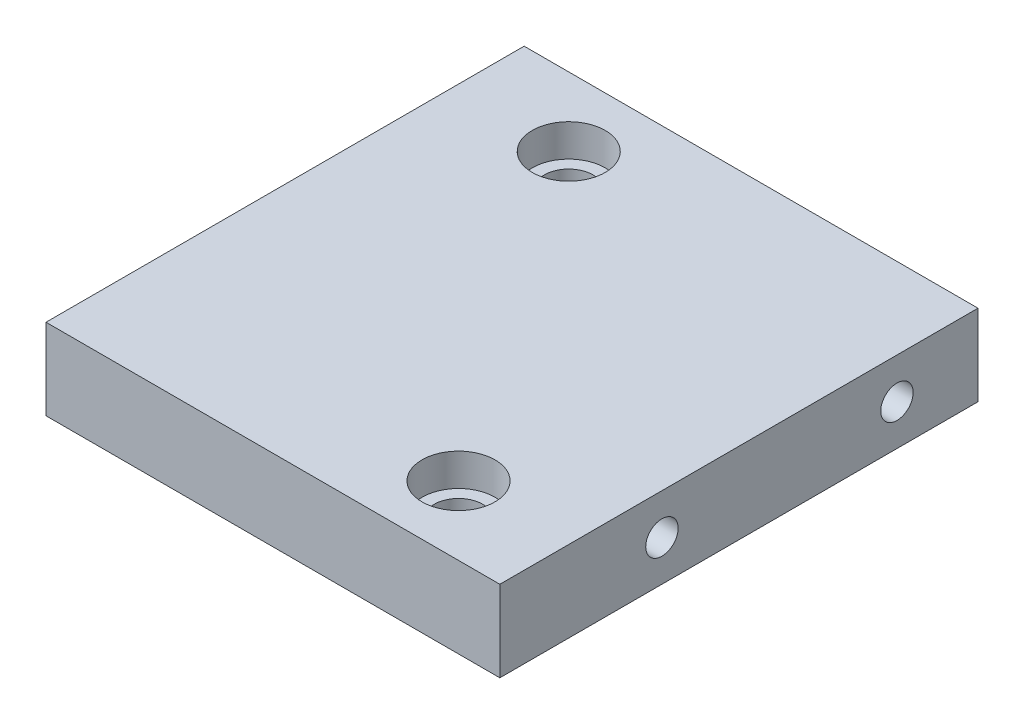
ISO-10303-21;
HEADER;
FILE_DESCRIPTION(('STEP AP214'),'2;1');
FILE_NAME('part.step','',(''),(''),'','','');
FILE_SCHEMA(('AUTOMOTIVE_DESIGN { 1 0 10303 214 1 1 1 1 }'));
ENDSEC;
DATA;
#1=APPLICATION_CONTEXT('core data for automotive mechanical design processes');
#2=APPLICATION_PROTOCOL_DEFINITION('international standard','automotive_design',2000,#1);
#3=PRODUCT_CONTEXT('',#1,'mechanical');
#4=PRODUCT('Part','Part','',(#3));
#5=PRODUCT_RELATED_PRODUCT_CATEGORY('part','',(#4));
#6=PRODUCT_DEFINITION_FORMATION('','',#4);
#7=PRODUCT_DEFINITION_CONTEXT('part definition',#1,'design');
#8=PRODUCT_DEFINITION('design','',#6,#7);
#9=PRODUCT_DEFINITION_SHAPE('','',#8);
#10=(LENGTH_UNIT() NAMED_UNIT(*) SI_UNIT(.MILLI.,.METRE.));
#11=(NAMED_UNIT(*) PLANE_ANGLE_UNIT() SI_UNIT($,.RADIAN.));
#12=(NAMED_UNIT(*) SI_UNIT($,.STERADIAN.) SOLID_ANGLE_UNIT());
#13=UNCERTAINTY_MEASURE_WITH_UNIT(LENGTH_MEASURE(1.E-05),#10,'distance_accuracy_value','');
#14=(GEOMETRIC_REPRESENTATION_CONTEXT(3) GLOBAL_UNCERTAINTY_ASSIGNED_CONTEXT((#13)) GLOBAL_UNIT_ASSIGNED_CONTEXT((#10,
#11,#12)) REPRESENTATION_CONTEXT('',''));
#15=CARTESIAN_POINT('',(0.,0.,0.));
#16=DIRECTION('',(0.,0.,1.));
#17=DIRECTION('',(1.,0.,0.));
#18=AXIS2_PLACEMENT_3D('',#15,#16,#17);
#19=CARTESIAN_POINT('',(-6.8,5.,25.25));
#20=DIRECTION('',(0.,-1.,0.));
#21=DIRECTION('',(0.,0.,-1.));
#22=AXIS2_PLACEMENT_3D('',#19,#20,#21);
#23=CYLINDRICAL_SURFACE('',#22,1.5);
#24=CARTESIAN_POINT('',(-6.8,0.,25.25));
#25=DIRECTION('',(0.,1.,0.));
#26=DIRECTION('',(0.,0.,1.));
#27=AXIS2_PLACEMENT_3D('',#24,#25,#26);
#28=CIRCLE('',#27,1.5);
#29=CARTESIAN_POINT('',(-6.8,0.,26.75));
#30=VERTEX_POINT('',#29);
#31=EDGE_CURVE('E118',#30,#30,#28,.T.);
#32=ORIENTED_EDGE('',*,*,#31,.F.);
#33=EDGE_LOOP('',(#32));
#34=FACE_BOUND('',#33,.T.);
#35=CARTESIAN_POINT('',(-6.8,3.,25.25));
#36=DIRECTION('',(0.,1.,0.));
#37=DIRECTION('',(0.,0.,1.));
#38=AXIS2_PLACEMENT_3D('',#35,#36,#37);
#39=CIRCLE('',#38,1.5);
#40=CARTESIAN_POINT('',(-6.8,3.,26.75));
#41=VERTEX_POINT('',#40);
#42=EDGE_CURVE('E39',#41,#41,#39,.T.);
#43=ORIENTED_EDGE('',*,*,#42,.T.);
#44=EDGE_LOOP('',(#43));
#45=FACE_BOUND('',#44,.T.);
#46=ADVANCED_FACE('F35',(#34,#45),#23,.F.);
#47=CARTESIAN_POINT('',(-21.,5.,4.24999999999998));
#48=DIRECTION('',(0.,-1.,0.));
#49=DIRECTION('',(0.,0.,-1.));
#50=AXIS2_PLACEMENT_3D('',#47,#48,#49);
#51=CYLINDRICAL_SURFACE('',#50,1.5);
#52=CARTESIAN_POINT('',(-21.,0.,4.24999999999998));
#53=DIRECTION('',(0.,1.,0.));
#54=DIRECTION('',(0.,0.,1.));
#55=AXIS2_PLACEMENT_3D('',#52,#53,#54);
#56=CIRCLE('',#55,1.5);
#57=CARTESIAN_POINT('',(-21.,0.,5.74999999999997));
#58=VERTEX_POINT('',#57);
#59=EDGE_CURVE('E104',#58,#58,#56,.T.);
#60=ORIENTED_EDGE('',*,*,#59,.F.);
#61=EDGE_LOOP('',(#60));
#62=FACE_BOUND('',#61,.T.);
#63=CARTESIAN_POINT('',(-21.,3.,4.24999999999998));
#64=DIRECTION('',(0.,1.,0.));
#65=DIRECTION('',(0.,0.,1.));
#66=AXIS2_PLACEMENT_3D('',#63,#64,#65);
#67=CIRCLE('',#66,1.5);
#68=CARTESIAN_POINT('',(-21.,3.,5.74999999999997));
#69=VERTEX_POINT('',#68);
#70=EDGE_CURVE('E112',#69,#69,#67,.T.);
#71=ORIENTED_EDGE('',*,*,#70,.T.);
#72=EDGE_LOOP('',(#71));
#73=FACE_BOUND('',#72,.T.);
#74=ADVANCED_FACE('F147',(#62,#73),#51,.F.);
#75=CARTESIAN_POINT('',(-28.,5.,29.5));
#76=DIRECTION('',(0.,0.,-1.));
#77=DIRECTION('',(-1.,0.,0.));
#78=AXIS2_PLACEMENT_3D('',#75,#76,#77);
#79=PLANE('',#78);
#80=DIRECTION('',(1.,0.,0.));
#81=VECTOR('',#80,1.);
#82=CARTESIAN_POINT('',(-28.,0.,29.5));
#83=LINE('',#82,#81);
#84=CARTESIAN_POINT('',(-28.,0.,29.5));
#85=VERTEX_POINT('',#84);
#86=CARTESIAN_POINT('',(0.,0.,29.5));
#87=VERTEX_POINT('',#86);
#88=EDGE_CURVE('E102',#85,#87,#83,.T.);
#89=ORIENTED_EDGE('',*,*,#88,.T.);
#90=DIRECTION('',(0.,-1.,0.));
#91=VECTOR('',#90,1.);
#92=CARTESIAN_POINT('',(0.,5.,29.5));
#93=LINE('',#92,#91);
#94=CARTESIAN_POINT('',(0.,5.,29.5));
#95=VERTEX_POINT('',#94);
#96=EDGE_CURVE('E11',#95,#87,#93,.T.);
#97=ORIENTED_EDGE('',*,*,#96,.F.);
#98=DIRECTION('',(1.,0.,0.));
#99=VECTOR('',#98,1.);
#100=CARTESIAN_POINT('',(-28.,5.,29.5));
#101=LINE('',#100,#99);
#102=CARTESIAN_POINT('',(-28.,5.,29.5));
#103=VERTEX_POINT('',#102);
#104=EDGE_CURVE('E87',#103,#95,#101,.T.);
#105=ORIENTED_EDGE('',*,*,#104,.F.);
#106=DIRECTION('',(0.,-1.,0.));
#107=VECTOR('',#106,1.);
#108=CARTESIAN_POINT('',(-28.,5.,29.5));
#109=LINE('',#108,#107);
#110=EDGE_CURVE('E54',#103,#85,#109,.T.);
#111=ORIENTED_EDGE('',*,*,#110,.T.);
#112=EDGE_LOOP('',(#89,#97,#105,#111));
#113=FACE_BOUND('',#112,.T.);
#114=ADVANCED_FACE('F37',(#113),#79,.F.);
#115=CARTESIAN_POINT('',(0.,5.,29.5));
#116=DIRECTION('',(-1.,0.,0.));
#117=DIRECTION('',(0.,0.,1.));
#118=AXIS2_PLACEMENT_3D('',#115,#116,#117);
#119=PLANE('',#118);
#120=CARTESIAN_POINT('',(0.,2.5,5.));
#121=DIRECTION('',(-1.,0.,0.));
#122=DIRECTION('',(0.,0.,1.));
#123=AXIS2_PLACEMENT_3D('',#120,#121,#122);
#124=CIRCLE('',#123,1.);
#125=CARTESIAN_POINT('',(0.,2.5,6.));
#126=VERTEX_POINT('',#125);
#127=EDGE_CURVE('E189',#126,#126,#124,.T.);
#128=ORIENTED_EDGE('',*,*,#127,.T.);
#129=EDGE_LOOP('',(#128));
#130=FACE_BOUND('',#129,.T.);
#131=CARTESIAN_POINT('',(0.,2.5,19.5));
#132=DIRECTION('',(-1.,0.,0.));
#133=DIRECTION('',(0.,0.,1.));
#134=AXIS2_PLACEMENT_3D('',#131,#132,#133);
#135=CIRCLE('',#134,1.);
#136=CARTESIAN_POINT('',(0.,2.5,20.5));
#137=VERTEX_POINT('',#136);
#138=EDGE_CURVE('E128',#137,#137,#135,.T.);
#139=ORIENTED_EDGE('',*,*,#138,.T.);
#140=EDGE_LOOP('',(#139));
#141=FACE_BOUND('',#140,.T.);
#142=DIRECTION('',(0.,0.,-1.));
#143=VECTOR('',#142,1.);
#144=CARTESIAN_POINT('',(0.,0.,29.5));
#145=LINE('',#144,#143);
#146=CARTESIAN_POINT('',(0.,0.,0.));
#147=VERTEX_POINT('',#146);
#148=EDGE_CURVE('E92',#87,#147,#145,.T.);
#149=ORIENTED_EDGE('',*,*,#148,.T.);
#150=DIRECTION('',(0.,-1.,0.));
#151=VECTOR('',#150,1.);
#152=CARTESIAN_POINT('',(0.,5.,0.));
#153=LINE('',#152,#151);
#154=CARTESIAN_POINT('',(0.,5.,0.));
#155=VERTEX_POINT('',#154);
#156=EDGE_CURVE('E45',#155,#147,#153,.T.);
#157=ORIENTED_EDGE('',*,*,#156,.F.);
#158=DIRECTION('',(0.,0.,-1.));
#159=VECTOR('',#158,1.);
#160=CARTESIAN_POINT('',(0.,5.,29.5));
#161=LINE('',#160,#159);
#162=EDGE_CURVE('E79',#95,#155,#161,.T.);
#163=ORIENTED_EDGE('',*,*,#162,.F.);
#164=ORIENTED_EDGE('',*,*,#96,.T.);
#165=EDGE_LOOP('',(#149,#157,#163,#164));
#166=FACE_BOUND('',#165,.T.);
#167=ADVANCED_FACE('F91',(#130,#141,#166),#119,.F.);
#168=CARTESIAN_POINT('',(-28.,5.,0.));
#169=DIRECTION('',(0.,0.,-1.));
#170=DIRECTION('',(-1.,0.,0.));
#171=AXIS2_PLACEMENT_3D('',#168,#169,#170);
#172=PLANE('',#171);
#173=DIRECTION('',(1.,0.,0.));
#174=VECTOR('',#173,1.);
#175=CARTESIAN_POINT('',(-28.,0.,0.));
#176=LINE('',#175,#174);
#177=CARTESIAN_POINT('',(-28.,0.,0.));
#178=VERTEX_POINT('',#177);
#179=EDGE_CURVE('E106',#178,#147,#176,.T.);
#180=ORIENTED_EDGE('',*,*,#179,.F.);
#181=DIRECTION('',(0.,-1.,0.));
#182=VECTOR('',#181,1.);
#183=CARTESIAN_POINT('',(-28.,5.,0.));
#184=LINE('',#183,#182);
#185=CARTESIAN_POINT('',(-28.,5.,0.));
#186=VERTEX_POINT('',#185);
#187=EDGE_CURVE('E68',#186,#178,#184,.T.);
#188=ORIENTED_EDGE('',*,*,#187,.F.);
#189=DIRECTION('',(1.,0.,0.));
#190=VECTOR('',#189,1.);
#191=CARTESIAN_POINT('',(-28.,5.,0.));
#192=LINE('',#191,#190);
#193=EDGE_CURVE('E86',#186,#155,#192,.T.);
#194=ORIENTED_EDGE('',*,*,#193,.T.);
#195=ORIENTED_EDGE('',*,*,#156,.T.);
#196=EDGE_LOOP('',(#180,#188,#194,#195));
#197=FACE_BOUND('',#196,.T.);
#198=ADVANCED_FACE('F96',(#197),#172,.T.);
#199=CARTESIAN_POINT('',(-28.,5.,29.5));
#200=DIRECTION('',(-1.,0.,0.));
#201=DIRECTION('',(0.,0.,1.));
#202=AXIS2_PLACEMENT_3D('',#199,#200,#201);
#203=PLANE('',#202);
#204=DIRECTION('',(0.,0.,-1.));
#205=VECTOR('',#204,1.);
#206=CARTESIAN_POINT('',(-28.,0.,29.5));
#207=LINE('',#206,#205);
#208=EDGE_CURVE('E108',#85,#178,#207,.T.);
#209=ORIENTED_EDGE('',*,*,#208,.F.);
#210=ORIENTED_EDGE('',*,*,#110,.F.);
#211=DIRECTION('',(0.,0.,-1.));
#212=VECTOR('',#211,1.);
#213=CARTESIAN_POINT('',(-28.,5.,29.5));
#214=LINE('',#213,#212);
#215=EDGE_CURVE('E97',#103,#186,#214,.T.);
#216=ORIENTED_EDGE('',*,*,#215,.T.);
#217=ORIENTED_EDGE('',*,*,#187,.T.);
#218=EDGE_LOOP('',(#209,#210,#216,#217));
#219=FACE_BOUND('',#218,.T.);
#220=ADVANCED_FACE('F166',(#219),#203,.T.);
#221=CARTESIAN_POINT('',(0.,5.,0.));
#222=DIRECTION('',(0.,1.,0.));
#223=DIRECTION('',(0.,0.,1.));
#224=AXIS2_PLACEMENT_3D('',#221,#222,#223);
#225=PLANE('',#224);
#226=CARTESIAN_POINT('',(-21.,5.,4.24999999999998));
#227=DIRECTION('',(0.,1.,0.));
#228=DIRECTION('',(0.,0.,1.));
#229=AXIS2_PLACEMENT_3D('',#226,#227,#228);
#230=CIRCLE('',#229,2.25);
#231=CARTESIAN_POINT('',(-21.,5.,6.49999999999997));
#232=VERTEX_POINT('',#231);
#233=EDGE_CURVE('E120',#232,#232,#230,.T.);
#234=ORIENTED_EDGE('',*,*,#233,.F.);
#235=EDGE_LOOP('',(#234));
#236=FACE_BOUND('',#235,.T.);
#237=CARTESIAN_POINT('',(-6.8,5.,25.25));
#238=DIRECTION('',(0.,1.,0.));
#239=DIRECTION('',(0.,0.,1.));
#240=AXIS2_PLACEMENT_3D('',#237,#238,#239);
#241=CIRCLE('',#240,2.25);
#242=CARTESIAN_POINT('',(-6.8,5.,27.5));
#243=VERTEX_POINT('',#242);
#244=EDGE_CURVE('E125',#243,#243,#241,.T.);
#245=ORIENTED_EDGE('',*,*,#244,.F.);
#246=EDGE_LOOP('',(#245));
#247=FACE_BOUND('',#246,.T.);
#248=ORIENTED_EDGE('',*,*,#104,.T.);
#249=ORIENTED_EDGE('',*,*,#162,.T.);
#250=ORIENTED_EDGE('',*,*,#193,.F.);
#251=ORIENTED_EDGE('',*,*,#215,.F.);
#252=EDGE_LOOP('',(#248,#249,#250,#251));
#253=FACE_BOUND('',#252,.T.);
#254=ADVANCED_FACE('F83',(#236,#247,#253),#225,.T.);
#255=CARTESIAN_POINT('',(0.,0.,0.));
#256=DIRECTION('',(0.,1.,0.));
#257=DIRECTION('',(0.,0.,1.));
#258=AXIS2_PLACEMENT_3D('',#255,#256,#257);
#259=PLANE('',#258);
#260=ORIENTED_EDGE('',*,*,#59,.T.);
#261=EDGE_LOOP('',(#260));
#262=FACE_BOUND('',#261,.T.);
#263=ORIENTED_EDGE('',*,*,#31,.T.);
#264=EDGE_LOOP('',(#263));
#265=FACE_BOUND('',#264,.T.);
#266=ORIENTED_EDGE('',*,*,#88,.F.);
#267=ORIENTED_EDGE('',*,*,#208,.T.);
#268=ORIENTED_EDGE('',*,*,#179,.T.);
#269=ORIENTED_EDGE('',*,*,#148,.F.);
#270=EDGE_LOOP('',(#266,#267,#268,#269));
#271=FACE_BOUND('',#270,.T.);
#272=ADVANCED_FACE('F142',(#262,#265,#271),#259,.F.);
#273=CARTESIAN_POINT('',(-21.,3.,4.24999999999998));
#274=DIRECTION('',(0.,1.,0.));
#275=DIRECTION('',(0.,0.,1.));
#276=AXIS2_PLACEMENT_3D('',#273,#274,#275);
#277=CYLINDRICAL_SURFACE('',#276,2.25);
#278=CARTESIAN_POINT('',(-21.,3.,4.24999999999998));
#279=DIRECTION('',(0.,1.,0.));
#280=DIRECTION('',(0.,0.,1.));
#281=AXIS2_PLACEMENT_3D('',#278,#279,#280);
#282=CIRCLE('',#281,2.25);
#283=CARTESIAN_POINT('',(-21.,3.,6.49999999999997));
#284=VERTEX_POINT('',#283);
#285=EDGE_CURVE('E114',#284,#284,#282,.T.);
#286=ORIENTED_EDGE('',*,*,#285,.F.);
#287=EDGE_LOOP('',(#286));
#288=FACE_BOUND('',#287,.T.);
#289=ORIENTED_EDGE('',*,*,#233,.T.);
#290=EDGE_LOOP('',(#289));
#291=FACE_BOUND('',#290,.T.);
#292=ADVANCED_FACE('F173',(#288,#291),#277,.F.);
#293=CARTESIAN_POINT('',(-21.,3.,4.24999999999998));
#294=DIRECTION('',(0.,1.,0.));
#295=DIRECTION('',(0.,0.,1.));
#296=AXIS2_PLACEMENT_3D('',#293,#294,#295);
#297=PLANE('',#296);
#298=ORIENTED_EDGE('',*,*,#70,.F.);
#299=EDGE_LOOP('',(#298));
#300=FACE_BOUND('',#299,.T.);
#301=ORIENTED_EDGE('',*,*,#285,.T.);
#302=EDGE_LOOP('',(#301));
#303=FACE_BOUND('',#302,.T.);
#304=ADVANCED_FACE('F161',(#300,#303),#297,.T.);
#305=CARTESIAN_POINT('',(-6.8,3.,25.25));
#306=DIRECTION('',(0.,1.,0.));
#307=DIRECTION('',(0.,0.,1.));
#308=AXIS2_PLACEMENT_3D('',#305,#306,#307);
#309=CYLINDRICAL_SURFACE('',#308,2.25);
#310=CARTESIAN_POINT('',(-6.8,3.,25.25));
#311=DIRECTION('',(0.,1.,0.));
#312=DIRECTION('',(0.,0.,1.));
#313=AXIS2_PLACEMENT_3D('',#310,#311,#312);
#314=CIRCLE('',#313,2.25);
#315=CARTESIAN_POINT('',(-6.8,3.,27.5));
#316=VERTEX_POINT('',#315);
#317=EDGE_CURVE('E133',#316,#316,#314,.T.);
#318=ORIENTED_EDGE('',*,*,#317,.F.);
#319=EDGE_LOOP('',(#318));
#320=FACE_BOUND('',#319,.T.);
#321=ORIENTED_EDGE('',*,*,#244,.T.);
#322=EDGE_LOOP('',(#321));
#323=FACE_BOUND('',#322,.T.);
#324=ADVANCED_FACE('F155',(#320,#323),#309,.F.);
#325=CARTESIAN_POINT('',(-6.8,3.,25.25));
#326=DIRECTION('',(0.,1.,0.));
#327=DIRECTION('',(0.,0.,1.));
#328=AXIS2_PLACEMENT_3D('',#325,#326,#327);
#329=PLANE('',#328);
#330=ORIENTED_EDGE('',*,*,#42,.F.);
#331=EDGE_LOOP('',(#330));
#332=FACE_BOUND('',#331,.T.);
#333=ORIENTED_EDGE('',*,*,#317,.T.);
#334=EDGE_LOOP('',(#333));
#335=FACE_BOUND('',#334,.T.);
#336=ADVANCED_FACE('F151',(#332,#335),#329,.T.);
#337=CARTESIAN_POINT('',(-4.,2.5,19.5));
#338=DIRECTION('',(1.,0.,0.));
#339=DIRECTION('',(0.,0.,-1.));
#340=AXIS2_PLACEMENT_3D('',#337,#338,#339);
#341=CYLINDRICAL_SURFACE('',#340,1.);
#342=CARTESIAN_POINT('',(-4.,2.5,19.5));
#343=DIRECTION('',(-1.,0.,0.));
#344=DIRECTION('',(0.,0.,1.));
#345=AXIS2_PLACEMENT_3D('',#342,#343,#344);
#346=CIRCLE('',#345,1.);
#347=CARTESIAN_POINT('',(-4.,2.5,20.5));
#348=VERTEX_POINT('',#347);
#349=EDGE_CURVE('E193',#348,#348,#346,.T.);
#350=ORIENTED_EDGE('',*,*,#349,.T.);
#351=EDGE_LOOP('',(#350));
#352=FACE_BOUND('',#351,.T.);
#353=ORIENTED_EDGE('',*,*,#138,.F.);
#354=EDGE_LOOP('',(#353));
#355=FACE_BOUND('',#354,.T.);
#356=ADVANCED_FACE('F154',(#352,#355),#341,.F.);
#357=CARTESIAN_POINT('',(-4.,2.5,19.5));
#358=DIRECTION('',(-1.,0.,0.));
#359=DIRECTION('',(0.,0.,1.));
#360=AXIS2_PLACEMENT_3D('',#357,#358,#359);
#361=PLANE('',#360);
#362=ORIENTED_EDGE('',*,*,#349,.F.);
#363=EDGE_LOOP('',(#362));
#364=FACE_BOUND('',#363,.T.);
#365=ADVANCED_FACE('F211',(#364),#361,.F.);
#366=CARTESIAN_POINT('',(-4.,2.5,5.));
#367=DIRECTION('',(1.,0.,0.));
#368=DIRECTION('',(0.,0.,-1.));
#369=AXIS2_PLACEMENT_3D('',#366,#367,#368);
#370=CYLINDRICAL_SURFACE('',#369,1.);
#371=CARTESIAN_POINT('',(-4.,2.5,5.));
#372=DIRECTION('',(-1.,0.,0.));
#373=DIRECTION('',(0.,0.,1.));
#374=AXIS2_PLACEMENT_3D('',#371,#372,#373);
#375=CIRCLE('',#374,1.);
#376=CARTESIAN_POINT('',(-4.,2.5,6.));
#377=VERTEX_POINT('',#376);
#378=EDGE_CURVE('E136',#377,#377,#375,.T.);
#379=ORIENTED_EDGE('',*,*,#378,.T.);
#380=EDGE_LOOP('',(#379));
#381=FACE_BOUND('',#380,.T.);
#382=ORIENTED_EDGE('',*,*,#127,.F.);
#383=EDGE_LOOP('',(#382));
#384=FACE_BOUND('',#383,.T.);
#385=ADVANCED_FACE('F202',(#381,#384),#370,.F.);
#386=CARTESIAN_POINT('',(-4.,2.5,5.));
#387=DIRECTION('',(-1.,0.,0.));
#388=DIRECTION('',(0.,0.,1.));
#389=AXIS2_PLACEMENT_3D('',#386,#387,#388);
#390=PLANE('',#389);
#391=ORIENTED_EDGE('',*,*,#378,.F.);
#392=EDGE_LOOP('',(#391));
#393=FACE_BOUND('',#392,.T.);
#394=ADVANCED_FACE('F205',(#393),#390,.F.);
#395=CLOSED_SHELL('',(#46,#74,#114,#167,#198,#220,#254,#272,#292,#304,#324,#336,#356,#365,#385,#394));
#396=MANIFOLD_SOLID_BREP('B2',#395);
#397=ADVANCED_BREP_SHAPE_REPRESENTATION('',(#18,#396),#14);
#398=SHAPE_DEFINITION_REPRESENTATION(#9,#397);
ENDSEC;
END-ISO-10303-21;
